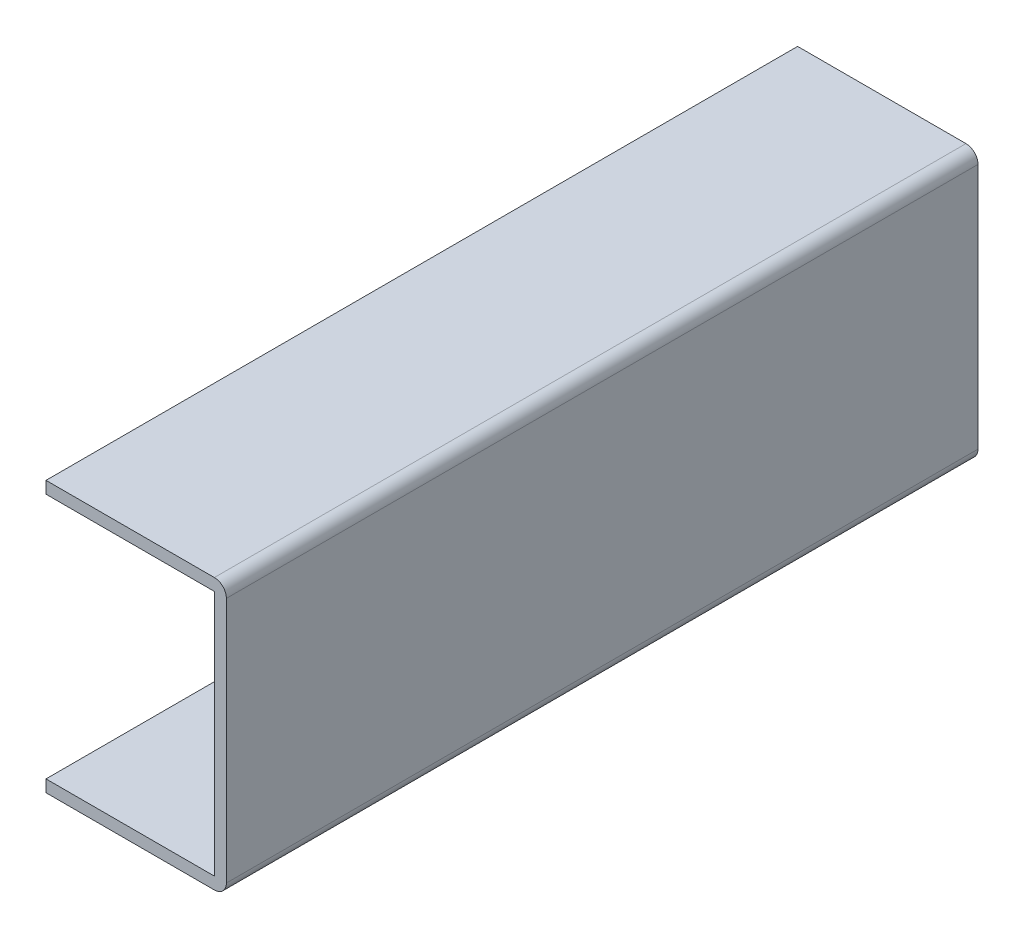
ISO-10303-21;
HEADER;
FILE_DESCRIPTION(('STEP AP214'),'2;1');
FILE_NAME('part.step','',(''),(''),'','','');
FILE_SCHEMA(('AUTOMOTIVE_DESIGN { 1 0 10303 214 1 1 1 1 }'));
ENDSEC;
DATA;
#1=APPLICATION_CONTEXT('core data for automotive mechanical design processes');
#2=APPLICATION_PROTOCOL_DEFINITION('international standard','automotive_design',2000,#1);
#3=PRODUCT_CONTEXT('',#1,'mechanical');
#4=PRODUCT('Part','Part','',(#3));
#5=PRODUCT_RELATED_PRODUCT_CATEGORY('part','',(#4));
#6=PRODUCT_DEFINITION_FORMATION('','',#4);
#7=PRODUCT_DEFINITION_CONTEXT('part definition',#1,'design');
#8=PRODUCT_DEFINITION('design','',#6,#7);
#9=PRODUCT_DEFINITION_SHAPE('','',#8);
#10=(LENGTH_UNIT() NAMED_UNIT(*) SI_UNIT(.MILLI.,.METRE.));
#11=(NAMED_UNIT(*) PLANE_ANGLE_UNIT() SI_UNIT($,.RADIAN.));
#12=(NAMED_UNIT(*) SI_UNIT($,.STERADIAN.) SOLID_ANGLE_UNIT());
#13=UNCERTAINTY_MEASURE_WITH_UNIT(LENGTH_MEASURE(1.E-05),#10,'distance_accuracy_value','');
#14=(GEOMETRIC_REPRESENTATION_CONTEXT(3) GLOBAL_UNCERTAINTY_ASSIGNED_CONTEXT((#13)) GLOBAL_UNIT_ASSIGNED_CONTEXT((#10,
#11,#12)) REPRESENTATION_CONTEXT('',''));
#15=CARTESIAN_POINT('',(0.,0.,0.));
#16=DIRECTION('',(0.,0.,1.));
#17=DIRECTION('',(1.,0.,0.));
#18=AXIS2_PLACEMENT_3D('',#15,#16,#17);
#19=CARTESIAN_POINT('',(-8.01209562671684,-28.7317615618949,1.25));
#20=DIRECTION('',(1.,0.,0.));
#21=DIRECTION('',(0.,0.,-1.));
#22=AXIS2_PLACEMENT_3D('',#19,#20,#21);
#23=PLANE('',#22);
#24=DIRECTION('',(0.,-1.,0.));
#25=VECTOR('',#24,1.);
#26=CARTESIAN_POINT('',(-8.01209562671684,-28.7317615618949,0.));
#27=LINE('',#26,#25);
#28=CARTESIAN_POINT('',(-8.01209562671684,-28.7317615618949,0.));
#29=VERTEX_POINT('',#28);
#30=CARTESIAN_POINT('',(-8.01209562671684,-28.7517615618949,0.));
#31=VERTEX_POINT('',#30);
#32=EDGE_CURVE('E133',#29,#31,#27,.T.);
#33=ORIENTED_EDGE('',*,*,#32,.T.);
#34=DIRECTION('',(0.,0.,-1.));
#35=VECTOR('',#34,1.);
#36=CARTESIAN_POINT('',(-8.01209562671684,-28.7517615618949,1.25));
#37=LINE('',#36,#35);
#38=CARTESIAN_POINT('',(-8.01209562671684,-28.7517615618949,1.25));
#39=VERTEX_POINT('',#38);
#40=EDGE_CURVE('E114',#39,#31,#37,.T.);
#41=ORIENTED_EDGE('',*,*,#40,.F.);
#42=DIRECTION('',(0.,-1.,0.));
#43=VECTOR('',#42,1.);
#44=CARTESIAN_POINT('',(-8.01209562671684,-28.7317615618949,1.25));
#45=LINE('',#44,#43);
#46=CARTESIAN_POINT('',(-8.01209562671684,-28.7317615618949,1.25));
#47=VERTEX_POINT('',#46);
#48=EDGE_CURVE('E121',#47,#39,#45,.T.);
#49=ORIENTED_EDGE('',*,*,#48,.F.);
#50=DIRECTION('',(0.,0.,-1.));
#51=VECTOR('',#50,1.);
#52=CARTESIAN_POINT('',(-8.01209562671684,-28.7317615618949,1.25));
#53=LINE('',#52,#51);
#54=EDGE_CURVE('E171',#47,#29,#53,.T.);
#55=ORIENTED_EDGE('',*,*,#54,.T.);
#56=EDGE_LOOP('',(#33,#41,#49,#55));
#57=FACE_BOUND('',#56,.T.);
#58=ADVANCED_FACE('F33',(#57),#23,.F.);
#59=CARTESIAN_POINT('',(-8.01209562671684,-28.7517615618949,1.25));
#60=DIRECTION('',(0.,1.,0.));
#61=DIRECTION('',(0.,0.,1.));
#62=AXIS2_PLACEMENT_3D('',#59,#60,#61);
#63=PLANE('',#62);
#64=DIRECTION('',(1.,0.,0.));
#65=VECTOR('',#64,1.);
#66=CARTESIAN_POINT('',(-8.01209562671684,-28.7517615618949,0.));
#67=LINE('',#66,#65);
#68=CARTESIAN_POINT('',(-7.73209562671684,-28.7517615618949,0.));
#69=VERTEX_POINT('',#68);
#70=EDGE_CURVE('E192',#31,#69,#67,.T.);
#71=ORIENTED_EDGE('',*,*,#70,.T.);
#72=DIRECTION('',(0.,0.,-1.));
#73=VECTOR('',#72,1.);
#74=CARTESIAN_POINT('',(-7.73209562671684,-28.7517615618949,1.25));
#75=LINE('',#74,#73);
#76=CARTESIAN_POINT('',(-7.73209562671684,-28.7517615618949,1.25));
#77=VERTEX_POINT('',#76);
#78=EDGE_CURVE('E117',#77,#69,#75,.T.);
#79=ORIENTED_EDGE('',*,*,#78,.F.);
#80=DIRECTION('',(1.,0.,0.));
#81=VECTOR('',#80,1.);
#82=CARTESIAN_POINT('',(-8.01209562671684,-28.7517615618949,1.25));
#83=LINE('',#82,#81);
#84=EDGE_CURVE('E110',#39,#77,#83,.T.);
#85=ORIENTED_EDGE('',*,*,#84,.F.);
#86=ORIENTED_EDGE('',*,*,#40,.T.);
#87=EDGE_LOOP('',(#71,#79,#85,#86));
#88=FACE_BOUND('',#87,.T.);
#89=ADVANCED_FACE('F112',(#88),#63,.F.);
#90=CARTESIAN_POINT('',(-7.73209562671684,-28.7517615618949,1.25));
#91=DIRECTION('',(1.,0.,0.));
#92=DIRECTION('',(0.,0.,-1.));
#93=AXIS2_PLACEMENT_3D('',#90,#91,#92);
#94=PLANE('',#93);
#95=DIRECTION('',(0.,-1.,0.));
#96=VECTOR('',#95,1.);
#97=CARTESIAN_POINT('',(-7.73209562671684,-28.7517615618949,0.));
#98=LINE('',#97,#96);
#99=CARTESIAN_POINT('',(-7.73209562671684,-29.1617615618949,0.));
#100=VERTEX_POINT('',#99);
#101=EDGE_CURVE('E190',#69,#100,#98,.T.);
#102=ORIENTED_EDGE('',*,*,#101,.T.);
#103=DIRECTION('',(0.,0.,-1.));
#104=VECTOR('',#103,1.);
#105=CARTESIAN_POINT('',(-7.73209562671684,-29.1617615618949,1.25));
#106=LINE('',#105,#104);
#107=CARTESIAN_POINT('',(-7.73209562671684,-29.1617615618949,1.25));
#108=VERTEX_POINT('',#107);
#109=EDGE_CURVE('E139',#108,#100,#106,.T.);
#110=ORIENTED_EDGE('',*,*,#109,.F.);
#111=DIRECTION('',(0.,-1.,0.));
#112=VECTOR('',#111,1.);
#113=CARTESIAN_POINT('',(-7.73209562671684,-28.7517615618949,1.25));
#114=LINE('',#113,#112);
#115=EDGE_CURVE('E120',#77,#108,#114,.T.);
#116=ORIENTED_EDGE('',*,*,#115,.F.);
#117=ORIENTED_EDGE('',*,*,#78,.T.);
#118=EDGE_LOOP('',(#102,#110,#116,#117));
#119=FACE_BOUND('',#118,.T.);
#120=ADVANCED_FACE('F204',(#119),#94,.F.);
#121=CARTESIAN_POINT('',(-7.73209562671684,-29.1617615618949,1.25));
#122=DIRECTION('',(0.,-1.,0.));
#123=DIRECTION('',(1.,0.,0.));
#124=AXIS2_PLACEMENT_3D('',#121,#122,#123);
#125=PLANE('',#124);
#126=DIRECTION('',(-1.,0.,0.));
#127=VECTOR('',#126,1.);
#128=CARTESIAN_POINT('',(-7.73209562671684,-29.1617615618949,0.));
#129=LINE('',#128,#127);
#130=CARTESIAN_POINT('',(-8.01209562671684,-29.1617615618949,0.));
#131=VERTEX_POINT('',#130);
#132=EDGE_CURVE('E185',#100,#131,#129,.T.);
#133=ORIENTED_EDGE('',*,*,#132,.T.);
#134=DIRECTION('',(0.,0.,-1.));
#135=VECTOR('',#134,1.);
#136=CARTESIAN_POINT('',(-8.01209562671684,-29.1617615618949,1.25));
#137=LINE('',#136,#135);
#138=CARTESIAN_POINT('',(-8.01209562671684,-29.1617615618949,1.25));
#139=VERTEX_POINT('',#138);
#140=EDGE_CURVE('E176',#139,#131,#137,.T.);
#141=ORIENTED_EDGE('',*,*,#140,.F.);
#142=DIRECTION('',(-1.,0.,0.));
#143=VECTOR('',#142,1.);
#144=CARTESIAN_POINT('',(-7.73209562671684,-29.1617615618949,1.25));
#145=LINE('',#144,#143);
#146=EDGE_CURVE('E186',#108,#139,#145,.T.);
#147=ORIENTED_EDGE('',*,*,#146,.F.);
#148=ORIENTED_EDGE('',*,*,#109,.T.);
#149=EDGE_LOOP('',(#133,#141,#147,#148));
#150=FACE_BOUND('',#149,.T.);
#151=ADVANCED_FACE('F183',(#150),#125,.F.);
#152=CARTESIAN_POINT('',(-8.01209562671684,-29.1617615618949,1.25));
#153=DIRECTION('',(1.,0.,0.));
#154=DIRECTION('',(0.,0.,-1.));
#155=AXIS2_PLACEMENT_3D('',#152,#153,#154);
#156=PLANE('',#155);
#157=DIRECTION('',(0.,-1.,0.));
#158=VECTOR('',#157,1.);
#159=CARTESIAN_POINT('',(-8.01209562671684,-29.1617615618949,0.));
#160=LINE('',#159,#158);
#161=CARTESIAN_POINT('',(-8.01209562671684,-29.1817615618949,0.));
#162=VERTEX_POINT('',#161);
#163=EDGE_CURVE('E167',#131,#162,#160,.T.);
#164=ORIENTED_EDGE('',*,*,#163,.T.);
#165=DIRECTION('',(0.,0.,-1.));
#166=VECTOR('',#165,1.);
#167=CARTESIAN_POINT('',(-8.01209562671684,-29.1817615618949,1.25));
#168=LINE('',#167,#166);
#169=CARTESIAN_POINT('',(-8.01209562671684,-29.1817615618949,1.25));
#170=VERTEX_POINT('',#169);
#171=EDGE_CURVE('E173',#170,#162,#168,.T.);
#172=ORIENTED_EDGE('',*,*,#171,.F.);
#173=DIRECTION('',(0.,-1.,0.));
#174=VECTOR('',#173,1.);
#175=CARTESIAN_POINT('',(-8.01209562671684,-29.1617615618949,1.25));
#176=LINE('',#175,#174);
#177=EDGE_CURVE('E201',#139,#170,#176,.T.);
#178=ORIENTED_EDGE('',*,*,#177,.F.);
#179=ORIENTED_EDGE('',*,*,#140,.T.);
#180=EDGE_LOOP('',(#164,#172,#178,#179));
#181=FACE_BOUND('',#180,.T.);
#182=ADVANCED_FACE('F211',(#181),#156,.F.);
#183=CARTESIAN_POINT('',(-8.01209562671684,-29.1817615618949,1.25));
#184=DIRECTION('',(0.,1.,0.));
#185=DIRECTION('',(0.,0.,1.));
#186=AXIS2_PLACEMENT_3D('',#183,#184,#185);
#187=PLANE('',#186);
#188=DIRECTION('',(1.,0.,0.));
#189=VECTOR('',#188,1.);
#190=CARTESIAN_POINT('',(-8.01209562671684,-29.1817615618949,0.));
#191=LINE('',#190,#189);
#192=CARTESIAN_POINT('',(-7.73209562671684,-29.1817615618949,0.));
#193=VERTEX_POINT('',#192);
#194=EDGE_CURVE('E164',#162,#193,#191,.T.);
#195=ORIENTED_EDGE('',*,*,#194,.T.);
#196=DIRECTION('',(0.,0.,-1.));
#197=VECTOR('',#196,1.);
#198=CARTESIAN_POINT('',(-7.73209562671684,-29.1817615618949,1.25));
#199=LINE('',#198,#197);
#200=CARTESIAN_POINT('',(-7.73209562671684,-29.1817615618949,1.25));
#201=VERTEX_POINT('',#200);
#202=EDGE_CURVE('E41',#193,#201,#199,.F.);
#203=ORIENTED_EDGE('',*,*,#202,.T.);
#204=DIRECTION('',(1.,0.,0.));
#205=VECTOR('',#204,1.);
#206=CARTESIAN_POINT('',(-8.01209562671684,-29.1817615618949,1.25));
#207=LINE('',#206,#205);
#208=EDGE_CURVE('E199',#170,#201,#207,.T.);
#209=ORIENTED_EDGE('',*,*,#208,.F.);
#210=ORIENTED_EDGE('',*,*,#171,.T.);
#211=EDGE_LOOP('',(#195,#203,#209,#210));
#212=FACE_BOUND('',#211,.T.);
#213=ADVANCED_FACE('F237',(#212),#187,.F.);
#214=CARTESIAN_POINT('',(-7.71209562671684,-29.1817615618949,1.25));
#215=DIRECTION('',(-1.,0.,0.));
#216=DIRECTION('',(0.,-1.,0.));
#217=AXIS2_PLACEMENT_3D('',#214,#215,#216);
#218=PLANE('',#217);
#219=DIRECTION('',(0.,1.,0.));
#220=VECTOR('',#219,1.);
#221=CARTESIAN_POINT('',(-7.71209562671684,-29.1817615618949,1.25));
#222=LINE('',#221,#220);
#223=CARTESIAN_POINT('',(-7.71209562671684,-29.1617615618949,1.25));
#224=VERTEX_POINT('',#223);
#225=CARTESIAN_POINT('',(-7.71209562671684,-28.7517615618949,1.25));
#226=VERTEX_POINT('',#225);
#227=EDGE_CURVE('E158',#224,#226,#222,.T.);
#228=ORIENTED_EDGE('',*,*,#227,.F.);
#229=DIRECTION('',(0.,0.,-1.));
#230=VECTOR('',#229,1.);
#231=CARTESIAN_POINT('',(-7.71209562671684,-29.1617615618949,1.25));
#232=LINE('',#231,#230);
#233=CARTESIAN_POINT('',(-7.71209562671684,-29.1617615618949,0.));
#234=VERTEX_POINT('',#233);
#235=EDGE_CURVE('E150',#224,#234,#232,.T.);
#236=ORIENTED_EDGE('',*,*,#235,.T.);
#237=DIRECTION('',(0.,1.,0.));
#238=VECTOR('',#237,1.);
#239=CARTESIAN_POINT('',(-7.71209562671684,-29.1817615618949,0.));
#240=LINE('',#239,#238);
#241=CARTESIAN_POINT('',(-7.71209562671684,-28.7517615618949,0.));
#242=VERTEX_POINT('',#241);
#243=EDGE_CURVE('E157',#234,#242,#240,.T.);
#244=ORIENTED_EDGE('',*,*,#243,.T.);
#245=DIRECTION('',(0.,0.,-1.));
#246=VECTOR('',#245,1.);
#247=CARTESIAN_POINT('',(-7.71209562671684,-28.7517615618949,1.25));
#248=LINE('',#247,#246);
#249=EDGE_CURVE('E145',#242,#226,#248,.F.);
#250=ORIENTED_EDGE('',*,*,#249,.T.);
#251=EDGE_LOOP('',(#228,#236,#244,#250));
#252=FACE_BOUND('',#251,.T.);
#253=ADVANCED_FACE('F156',(#252),#218,.F.);
#254=CARTESIAN_POINT('',(-7.71209562671684,-28.7317615618949,1.25));
#255=DIRECTION('',(0.,-1.,0.));
#256=DIRECTION('',(1.,0.,0.));
#257=AXIS2_PLACEMENT_3D('',#254,#255,#256);
#258=PLANE('',#257);
#259=DIRECTION('',(-1.,0.,0.));
#260=VECTOR('',#259,1.);
#261=CARTESIAN_POINT('',(-7.71209562671684,-28.7317615618949,1.25));
#262=LINE('',#261,#260);
#263=CARTESIAN_POINT('',(-7.73209562671684,-28.7317615618949,1.25));
#264=VERTEX_POINT('',#263);
#265=EDGE_CURVE('E126',#264,#47,#262,.T.);
#266=ORIENTED_EDGE('',*,*,#265,.F.);
#267=DIRECTION('',(0.,0.,-1.));
#268=VECTOR('',#267,1.);
#269=CARTESIAN_POINT('',(-7.73209562671684,-28.7317615618949,1.25));
#270=LINE('',#269,#268);
#271=CARTESIAN_POINT('',(-7.73209562671684,-28.7317615618949,0.));
#272=VERTEX_POINT('',#271);
#273=EDGE_CURVE('E134',#264,#272,#270,.T.);
#274=ORIENTED_EDGE('',*,*,#273,.T.);
#275=DIRECTION('',(-1.,0.,0.));
#276=VECTOR('',#275,1.);
#277=CARTESIAN_POINT('',(-7.71209562671684,-28.7317615618949,0.));
#278=LINE('',#277,#276);
#279=EDGE_CURVE('E130',#272,#29,#278,.T.);
#280=ORIENTED_EDGE('',*,*,#279,.T.);
#281=ORIENTED_EDGE('',*,*,#54,.F.);
#282=EDGE_LOOP('',(#266,#274,#280,#281));
#283=FACE_BOUND('',#282,.T.);
#284=ADVANCED_FACE('F229',(#283),#258,.F.);
#285=CARTESIAN_POINT('',(0.,0.,1.25));
#286=DIRECTION('',(0.,0.,1.));
#287=DIRECTION('',(1.,0.,0.));
#288=AXIS2_PLACEMENT_3D('',#285,#286,#287);
#289=PLANE('',#288);
#290=ORIENTED_EDGE('',*,*,#208,.T.);
#291=CARTESIAN_POINT('',(-7.73209562671684,-29.1617615618949,1.25));
#292=DIRECTION('',(0.,0.,1.));
#293=DIRECTION('',(1.,0.,0.));
#294=AXIS2_PLACEMENT_3D('',#291,#292,#293);
#295=CIRCLE('',#294,0.02);
#296=EDGE_CURVE('E11',#201,#224,#295,.T.);
#297=ORIENTED_EDGE('',*,*,#296,.T.);
#298=ORIENTED_EDGE('',*,*,#227,.T.);
#299=CARTESIAN_POINT('',(-7.73209562671684,-28.7517615618949,1.25));
#300=DIRECTION('',(0.,0.,1.));
#301=DIRECTION('',(1.,0.,0.));
#302=AXIS2_PLACEMENT_3D('',#299,#300,#301);
#303=CIRCLE('',#302,0.02);
#304=EDGE_CURVE('E148',#226,#264,#303,.T.);
#305=ORIENTED_EDGE('',*,*,#304,.T.);
#306=ORIENTED_EDGE('',*,*,#265,.T.);
#307=ORIENTED_EDGE('',*,*,#48,.T.);
#308=ORIENTED_EDGE('',*,*,#84,.T.);
#309=ORIENTED_EDGE('',*,*,#115,.T.);
#310=ORIENTED_EDGE('',*,*,#146,.T.);
#311=ORIENTED_EDGE('',*,*,#177,.T.);
#312=EDGE_LOOP('',(#290,#297,#298,#305,#306,#307,#308,#309,#310,#311));
#313=FACE_BOUND('',#312,.T.);
#314=ADVANCED_FACE('F124',(#313),#289,.T.);
#315=CARTESIAN_POINT('',(0.,0.,0.));
#316=DIRECTION('',(0.,0.,1.));
#317=DIRECTION('',(1.,0.,0.));
#318=AXIS2_PLACEMENT_3D('',#315,#316,#317);
#319=PLANE('',#318);
#320=ORIENTED_EDGE('',*,*,#243,.F.);
#321=CARTESIAN_POINT('',(-7.73209562671684,-29.1617615618949,0.));
#322=DIRECTION('',(0.,0.,1.));
#323=DIRECTION('',(1.,0.,0.));
#324=AXIS2_PLACEMENT_3D('',#321,#322,#323);
#325=CIRCLE('',#324,0.02);
#326=EDGE_CURVE('E55',#234,#193,#325,.F.);
#327=ORIENTED_EDGE('',*,*,#326,.T.);
#328=ORIENTED_EDGE('',*,*,#194,.F.);
#329=ORIENTED_EDGE('',*,*,#163,.F.);
#330=ORIENTED_EDGE('',*,*,#132,.F.);
#331=ORIENTED_EDGE('',*,*,#101,.F.);
#332=ORIENTED_EDGE('',*,*,#70,.F.);
#333=ORIENTED_EDGE('',*,*,#32,.F.);
#334=ORIENTED_EDGE('',*,*,#279,.F.);
#335=CARTESIAN_POINT('',(-7.73209562671684,-28.7517615618949,0.));
#336=DIRECTION('',(0.,0.,1.));
#337=DIRECTION('',(1.,0.,0.));
#338=AXIS2_PLACEMENT_3D('',#335,#336,#337);
#339=CIRCLE('',#338,0.02);
#340=EDGE_CURVE('E137',#272,#242,#339,.F.);
#341=ORIENTED_EDGE('',*,*,#340,.T.);
#342=EDGE_LOOP('',(#320,#327,#328,#329,#330,#331,#332,#333,#334,#341));
#343=FACE_BOUND('',#342,.T.);
#344=ADVANCED_FACE('F161',(#343),#319,.F.);
#345=CARTESIAN_POINT('',(-7.73209562671684,-28.7517615618949,1.25));
#346=DIRECTION('',(0.,0.,-1.));
#347=DIRECTION('',(-1.,0.,0.));
#348=AXIS2_PLACEMENT_3D('',#345,#346,#347);
#349=CYLINDRICAL_SURFACE('',#348,0.02);
#350=ORIENTED_EDGE('',*,*,#304,.F.);
#351=ORIENTED_EDGE('',*,*,#249,.F.);
#352=ORIENTED_EDGE('',*,*,#340,.F.);
#353=ORIENTED_EDGE('',*,*,#273,.F.);
#354=EDGE_LOOP('',(#350,#351,#352,#353));
#355=FACE_BOUND('',#354,.T.);
#356=ADVANCED_FACE('F218',(#355),#349,.T.);
#357=CARTESIAN_POINT('',(-7.73209562671684,-29.1617615618949,1.25));
#358=DIRECTION('',(0.,0.,-1.));
#359=DIRECTION('',(-1.,0.,0.));
#360=AXIS2_PLACEMENT_3D('',#357,#358,#359);
#361=CYLINDRICAL_SURFACE('',#360,0.02);
#362=ORIENTED_EDGE('',*,*,#296,.F.);
#363=ORIENTED_EDGE('',*,*,#202,.F.);
#364=ORIENTED_EDGE('',*,*,#326,.F.);
#365=ORIENTED_EDGE('',*,*,#235,.F.);
#366=EDGE_LOOP('',(#362,#363,#364,#365));
#367=FACE_BOUND('',#366,.T.);
#368=ADVANCED_FACE('F35',(#367),#361,.T.);
#369=CLOSED_SHELL('',(#58,#89,#120,#151,#182,#213,#253,#284,#314,#344,#356,#368));
#370=MANIFOLD_SOLID_BREP('B2',#369);
#371=ADVANCED_BREP_SHAPE_REPRESENTATION('',(#18,#370),#14);
#372=SHAPE_DEFINITION_REPRESENTATION(#9,#371);
ENDSEC;
END-ISO-10303-21;
